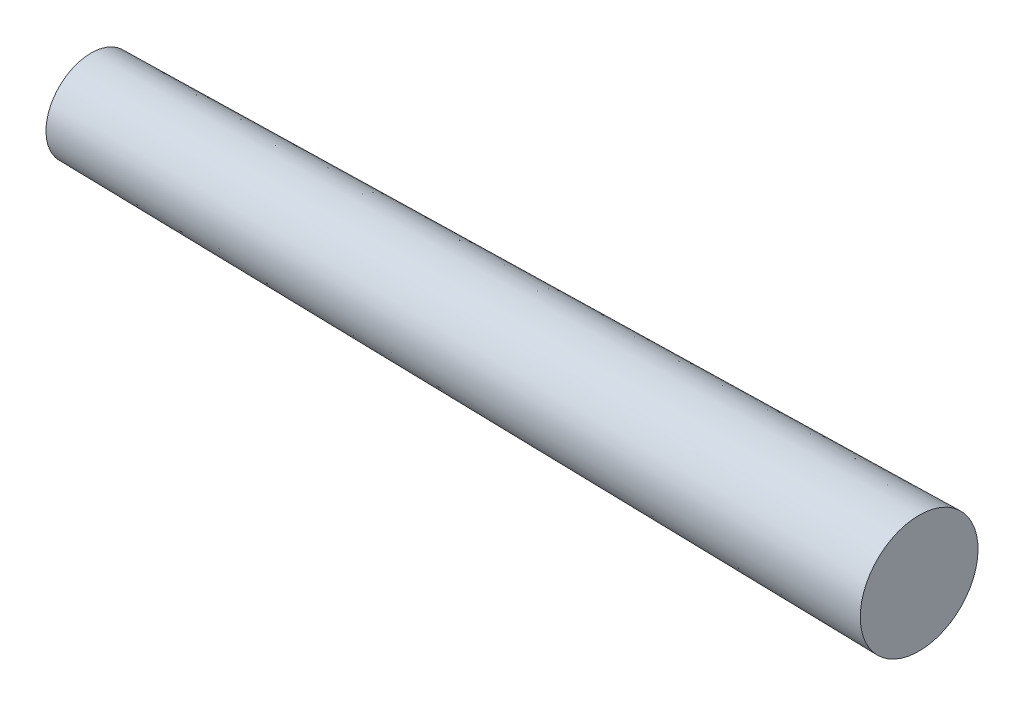
ISO-10303-21;
HEADER;
FILE_DESCRIPTION(('STEP AP214'),'2;1');
FILE_NAME('part.step','',(''),(''),'','','');
FILE_SCHEMA(('AUTOMOTIVE_DESIGN { 1 0 10303 214 1 1 1 1 }'));
ENDSEC;
DATA;
#1=APPLICATION_CONTEXT('core data for automotive mechanical design processes');
#2=APPLICATION_PROTOCOL_DEFINITION('international standard','automotive_design',2000,#1);
#3=PRODUCT_CONTEXT('',#1,'mechanical');
#4=PRODUCT('Part','Part','',(#3));
#5=PRODUCT_RELATED_PRODUCT_CATEGORY('part','',(#4));
#6=PRODUCT_DEFINITION_FORMATION('','',#4);
#7=PRODUCT_DEFINITION_CONTEXT('part definition',#1,'design');
#8=PRODUCT_DEFINITION('design','',#6,#7);
#9=PRODUCT_DEFINITION_SHAPE('','',#8);
#10=(LENGTH_UNIT() NAMED_UNIT(*) SI_UNIT(.MILLI.,.METRE.));
#11=(NAMED_UNIT(*) PLANE_ANGLE_UNIT() SI_UNIT($,.RADIAN.));
#12=(NAMED_UNIT(*) SI_UNIT($,.STERADIAN.) SOLID_ANGLE_UNIT());
#13=UNCERTAINTY_MEASURE_WITH_UNIT(LENGTH_MEASURE(1.E-05),#10,'distance_accuracy_value','');
#14=(GEOMETRIC_REPRESENTATION_CONTEXT(3) GLOBAL_UNCERTAINTY_ASSIGNED_CONTEXT((#13)) GLOBAL_UNIT_ASSIGNED_CONTEXT((#10,
#11,#12)) REPRESENTATION_CONTEXT('',''));
#15=CARTESIAN_POINT('',(0.,0.,0.));
#16=DIRECTION('',(0.,0.,1.));
#17=DIRECTION('',(1.,0.,0.));
#18=AXIS2_PLACEMENT_3D('',#15,#16,#17);
#19=CARTESIAN_POINT('',(69.4617656449553,0.,0.));
#20=DIRECTION('',(1.,0.,0.));
#21=DIRECTION('',(0.,1.,0.));
#22=AXIS2_PLACEMENT_3D('',#19,#20,#21);
#23=PLANE('',#22);
#24=CARTESIAN_POINT('',(69.4617656449553,0.,0.));
#25=DIRECTION('',(1.,0.,0.));
#26=DIRECTION('',(0.,1.,0.));
#27=AXIS2_PLACEMENT_3D('',#24,#25,#26);
#28=CIRCLE('',#27,5.33333333333333);
#29=CARTESIAN_POINT('',(69.4617656449553,5.33333333333334,0.));
#30=VERTEX_POINT('',#29);
#31=EDGE_CURVE('E10',#30,#30,#28,.T.);
#32=ORIENTED_EDGE('',*,*,#31,.T.);
#33=EDGE_LOOP('',(#32));
#34=FACE_BOUND('',#33,.T.);
#35=ADVANCED_FACE('F33',(#34),#23,.T.);
#36=CARTESIAN_POINT('',(69.4617656449553,0.,0.));
#37=DIRECTION('',(1.,0.,0.));
#38=DIRECTION('',(0.,1.,0.));
#39=AXIS2_PLACEMENT_3D('',#36,#37,#38);
#40=CONICAL_SURFACE('',#39,5.33333333333333,0.0166651237139408);
#41=CARTESIAN_POINT('',(-5.5382343550447,0.,0.));
#42=DIRECTION('',(1.,0.,0.));
#43=DIRECTION('',(0.,1.,0.));
#44=AXIS2_PLACEMENT_3D('',#41,#42,#43);
#45=CIRCLE('',#44,4.08333333333333);
#46=CARTESIAN_POINT('',(-5.5382343550447,4.08333333333333,0.));
#47=VERTEX_POINT('',#46);
#48=EDGE_CURVE('E39',#47,#47,#45,.T.);
#49=ORIENTED_EDGE('',*,*,#48,.T.);
#50=EDGE_LOOP('',(#49));
#51=FACE_BOUND('',#50,.T.);
#52=ORIENTED_EDGE('',*,*,#31,.F.);
#53=EDGE_LOOP('',(#52));
#54=FACE_BOUND('',#53,.T.);
#55=ADVANCED_FACE('F45',(#51,#54),#40,.T.);
#56=CARTESIAN_POINT('',(-5.53823435504471,0.,0.));
#57=DIRECTION('',(-1.,0.,0.));
#58=DIRECTION('',(0.,-1.,0.));
#59=AXIS2_PLACEMENT_3D('',#56,#57,#58);
#60=PLANE('',#59);
#61=ORIENTED_EDGE('',*,*,#48,.F.);
#62=EDGE_LOOP('',(#61));
#63=FACE_BOUND('',#62,.T.);
#64=ADVANCED_FACE('F48',(#63),#60,.T.);
#65=CLOSED_SHELL('',(#35,#55,#64));
#66=MANIFOLD_SOLID_BREP('B2',#65);
#67=ADVANCED_BREP_SHAPE_REPRESENTATION('',(#18,#66),#14);
#68=SHAPE_DEFINITION_REPRESENTATION(#9,#67);
ENDSEC;
END-ISO-10303-21;
